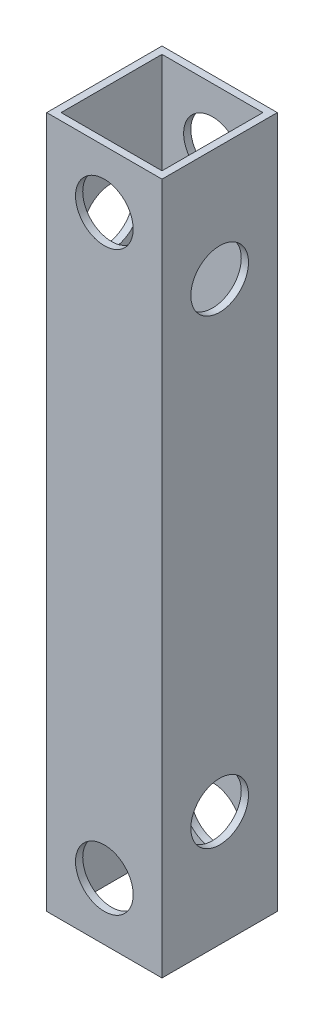
ISO-10303-21;
HEADER;
FILE_DESCRIPTION(('STEP AP214'),'2;1');
FILE_NAME('part.step','',(''),(''),'','','');
FILE_SCHEMA(('AUTOMOTIVE_DESIGN { 1 0 10303 214 1 1 1 1 }'));
ENDSEC;
DATA;
#1=APPLICATION_CONTEXT('core data for automotive mechanical design processes');
#2=APPLICATION_PROTOCOL_DEFINITION('international standard','automotive_design',2000,#1);
#3=PRODUCT_CONTEXT('',#1,'mechanical');
#4=PRODUCT('Part','Part','',(#3));
#5=PRODUCT_RELATED_PRODUCT_CATEGORY('part','',(#4));
#6=PRODUCT_DEFINITION_FORMATION('','',#4);
#7=PRODUCT_DEFINITION_CONTEXT('part definition',#1,'design');
#8=PRODUCT_DEFINITION('design','',#6,#7);
#9=PRODUCT_DEFINITION_SHAPE('','',#8);
#10=(LENGTH_UNIT() NAMED_UNIT(*) SI_UNIT(.MILLI.,.METRE.));
#11=(NAMED_UNIT(*) PLANE_ANGLE_UNIT() SI_UNIT($,.RADIAN.));
#12=(NAMED_UNIT(*) SI_UNIT($,.STERADIAN.) SOLID_ANGLE_UNIT());
#13=UNCERTAINTY_MEASURE_WITH_UNIT(LENGTH_MEASURE(1.E-05),#10,'distance_accuracy_value','');
#14=(GEOMETRIC_REPRESENTATION_CONTEXT(3) GLOBAL_UNCERTAINTY_ASSIGNED_CONTEXT((#13)) GLOBAL_UNIT_ASSIGNED_CONTEXT((#10,
#11,#12)) REPRESENTATION_CONTEXT('',''));
#15=CARTESIAN_POINT('',(0.,0.,0.));
#16=DIRECTION('',(0.,0.,1.));
#17=DIRECTION('',(1.,0.,0.));
#18=AXIS2_PLACEMENT_3D('',#15,#16,#17);
#19=CARTESIAN_POINT('',(0.,152.4,0.));
#20=DIRECTION('',(0.,1.,0.));
#21=DIRECTION('',(0.,0.,1.));
#22=AXIS2_PLACEMENT_3D('',#19,#20,#21);
#23=PLANE('',#22);
#24=DIRECTION('',(0.,0.,1.));
#25=VECTOR('',#24,1.);
#26=CARTESIAN_POINT('',(-12.7,152.4,12.7));
#27=LINE('',#26,#25);
#28=CARTESIAN_POINT('',(-12.7,152.4,-12.7));
#29=VERTEX_POINT('',#28);
#30=CARTESIAN_POINT('',(-12.7,152.4,12.7));
#31=VERTEX_POINT('',#30);
#32=EDGE_CURVE('E138',#29,#31,#27,.T.);
#33=ORIENTED_EDGE('',*,*,#32,.T.);
#34=DIRECTION('',(1.,0.,0.));
#35=VECTOR('',#34,1.);
#36=CARTESIAN_POINT('',(12.7,152.4,12.7));
#37=LINE('',#36,#35);
#38=CARTESIAN_POINT('',(12.7,152.4,12.7));
#39=VERTEX_POINT('',#38);
#40=EDGE_CURVE('E141',#31,#39,#37,.T.);
#41=ORIENTED_EDGE('',*,*,#40,.T.);
#42=DIRECTION('',(0.,0.,-1.));
#43=VECTOR('',#42,1.);
#44=CARTESIAN_POINT('',(12.7,152.4,12.7));
#45=LINE('',#44,#43);
#46=CARTESIAN_POINT('',(12.7,152.4,-12.7));
#47=VERTEX_POINT('',#46);
#48=EDGE_CURVE('E144',#39,#47,#45,.T.);
#49=ORIENTED_EDGE('',*,*,#48,.T.);
#50=DIRECTION('',(-1.,0.,0.));
#51=VECTOR('',#50,1.);
#52=CARTESIAN_POINT('',(12.7,152.4,-12.7));
#53=LINE('',#52,#51);
#54=EDGE_CURVE('E146',#47,#29,#53,.T.);
#55=ORIENTED_EDGE('',*,*,#54,.T.);
#56=EDGE_LOOP('',(#33,#41,#49,#55));
#57=FACE_BOUND('',#56,.T.);
#58=DIRECTION('',(1.,0.,0.));
#59=VECTOR('',#58,1.);
#60=CARTESIAN_POINT('',(11.1125,152.4,11.1125));
#61=LINE('',#60,#59);
#62=CARTESIAN_POINT('',(-11.1125,152.4,11.1125));
#63=VERTEX_POINT('',#62);
#64=CARTESIAN_POINT('',(11.1125,152.4,11.1125));
#65=VERTEX_POINT('',#64);
#66=EDGE_CURVE('E108',#63,#65,#61,.T.);
#67=ORIENTED_EDGE('',*,*,#66,.F.);
#68=DIRECTION('',(0.,0.,1.));
#69=VECTOR('',#68,1.);
#70=CARTESIAN_POINT('',(-11.1125,152.4,11.1125));
#71=LINE('',#70,#69);
#72=CARTESIAN_POINT('',(-11.1125,152.4,-11.1125));
#73=VERTEX_POINT('',#72);
#74=EDGE_CURVE('E100',#73,#63,#71,.T.);
#75=ORIENTED_EDGE('',*,*,#74,.F.);
#76=DIRECTION('',(-1.,0.,0.));
#77=VECTOR('',#76,1.);
#78=CARTESIAN_POINT('',(11.1125,152.4,-11.1125));
#79=LINE('',#78,#77);
#80=CARTESIAN_POINT('',(11.1125,152.4,-11.1125));
#81=VERTEX_POINT('',#80);
#82=EDGE_CURVE('E122',#81,#73,#79,.T.);
#83=ORIENTED_EDGE('',*,*,#82,.F.);
#84=DIRECTION('',(0.,0.,-1.));
#85=VECTOR('',#84,1.);
#86=CARTESIAN_POINT('',(11.1125,152.4,11.1125));
#87=LINE('',#86,#85);
#88=EDGE_CURVE('E120',#65,#81,#87,.T.);
#89=ORIENTED_EDGE('',*,*,#88,.F.);
#90=EDGE_LOOP('',(#67,#75,#83,#89));
#91=FACE_BOUND('',#90,.T.);
#92=ADVANCED_FACE('F33',(#57,#91),#23,.T.);
#93=CARTESIAN_POINT('',(0.,0.,0.));
#94=DIRECTION('',(0.,1.,0.));
#95=DIRECTION('',(0.,0.,1.));
#96=AXIS2_PLACEMENT_3D('',#93,#94,#95);
#97=PLANE('',#96);
#98=DIRECTION('',(0.,0.,1.));
#99=VECTOR('',#98,1.);
#100=CARTESIAN_POINT('',(-12.7,0.,12.7));
#101=LINE('',#100,#99);
#102=CARTESIAN_POINT('',(-12.7,0.,-12.7));
#103=VERTEX_POINT('',#102);
#104=CARTESIAN_POINT('',(-12.7,0.,12.7));
#105=VERTEX_POINT('',#104);
#106=EDGE_CURVE('E116',#103,#105,#101,.T.);
#107=ORIENTED_EDGE('',*,*,#106,.F.);
#108=DIRECTION('',(-1.,0.,0.));
#109=VECTOR('',#108,1.);
#110=CARTESIAN_POINT('',(12.7,0.,-12.7));
#111=LINE('',#110,#109);
#112=CARTESIAN_POINT('',(12.7,0.,-12.7));
#113=VERTEX_POINT('',#112);
#114=EDGE_CURVE('E142',#113,#103,#111,.T.);
#115=ORIENTED_EDGE('',*,*,#114,.F.);
#116=DIRECTION('',(0.,0.,-1.));
#117=VECTOR('',#116,1.);
#118=CARTESIAN_POINT('',(12.7,0.,12.7));
#119=LINE('',#118,#117);
#120=CARTESIAN_POINT('',(12.7,0.,12.7));
#121=VERTEX_POINT('',#120);
#122=EDGE_CURVE('E153',#121,#113,#119,.T.);
#123=ORIENTED_EDGE('',*,*,#122,.F.);
#124=DIRECTION('',(1.,0.,0.));
#125=VECTOR('',#124,1.);
#126=CARTESIAN_POINT('',(12.7,0.,12.7));
#127=LINE('',#126,#125);
#128=EDGE_CURVE('E151',#105,#121,#127,.T.);
#129=ORIENTED_EDGE('',*,*,#128,.F.);
#130=EDGE_LOOP('',(#107,#115,#123,#129));
#131=FACE_BOUND('',#130,.T.);
#132=DIRECTION('',(0.,0.,1.));
#133=VECTOR('',#132,1.);
#134=CARTESIAN_POINT('',(-11.1125,0.,11.1125));
#135=LINE('',#134,#133);
#136=CARTESIAN_POINT('',(-11.1125,0.,-11.1125));
#137=VERTEX_POINT('',#136);
#138=CARTESIAN_POINT('',(-11.1125,0.,11.1125));
#139=VERTEX_POINT('',#138);
#140=EDGE_CURVE('E58',#137,#139,#135,.T.);
#141=ORIENTED_EDGE('',*,*,#140,.T.);
#142=DIRECTION('',(1.,0.,0.));
#143=VECTOR('',#142,1.);
#144=CARTESIAN_POINT('',(11.1125,0.,11.1125));
#145=LINE('',#144,#143);
#146=CARTESIAN_POINT('',(11.1125,0.,11.1125));
#147=VERTEX_POINT('',#146);
#148=EDGE_CURVE('E115',#139,#147,#145,.T.);
#149=ORIENTED_EDGE('',*,*,#148,.T.);
#150=DIRECTION('',(0.,0.,-1.));
#151=VECTOR('',#150,1.);
#152=CARTESIAN_POINT('',(11.1125,0.,11.1125));
#153=LINE('',#152,#151);
#154=CARTESIAN_POINT('',(11.1125,0.,-11.1125));
#155=VERTEX_POINT('',#154);
#156=EDGE_CURVE('E130',#147,#155,#153,.T.);
#157=ORIENTED_EDGE('',*,*,#156,.T.);
#158=DIRECTION('',(-1.,0.,0.));
#159=VECTOR('',#158,1.);
#160=CARTESIAN_POINT('',(11.1125,0.,-11.1125));
#161=LINE('',#160,#159);
#162=EDGE_CURVE('E109',#155,#137,#161,.T.);
#163=ORIENTED_EDGE('',*,*,#162,.T.);
#164=EDGE_LOOP('',(#141,#149,#157,#163));
#165=FACE_BOUND('',#164,.T.);
#166=ADVANCED_FACE('F226',(#131,#165),#97,.F.);
#167=CARTESIAN_POINT('',(-12.7,152.4,12.7));
#168=DIRECTION('',(1.,0.,0.));
#169=DIRECTION('',(0.,0.,-1.));
#170=AXIS2_PLACEMENT_3D('',#167,#168,#169);
#171=PLANE('',#170);
#172=CARTESIAN_POINT('',(-12.7,25.4,0.));
#173=DIRECTION('',(1.,0.,0.));
#174=DIRECTION('',(0.,0.,-1.));
#175=AXIS2_PLACEMENT_3D('',#172,#173,#174);
#176=CIRCLE('',#175,6.35);
#177=CARTESIAN_POINT('',(-12.7,25.4,-6.35));
#178=VERTEX_POINT('',#177);
#179=EDGE_CURVE('E182',#178,#178,#176,.T.);
#180=ORIENTED_EDGE('',*,*,#179,.T.);
#181=EDGE_LOOP('',(#180));
#182=FACE_BOUND('',#181,.T.);
#183=CARTESIAN_POINT('',(-12.7,127.,0.));
#184=DIRECTION('',(1.,0.,0.));
#185=DIRECTION('',(0.,0.,-1.));
#186=AXIS2_PLACEMENT_3D('',#183,#184,#185);
#187=CIRCLE('',#186,6.35);
#188=CARTESIAN_POINT('',(-12.7,127.,-6.35));
#189=VERTEX_POINT('',#188);
#190=EDGE_CURVE('E197',#189,#189,#187,.T.);
#191=ORIENTED_EDGE('',*,*,#190,.T.);
#192=EDGE_LOOP('',(#191));
#193=FACE_BOUND('',#192,.T.);
#194=ORIENTED_EDGE('',*,*,#106,.T.);
#195=DIRECTION('',(0.,-1.,0.));
#196=VECTOR('',#195,1.);
#197=CARTESIAN_POINT('',(-12.7,152.4,12.7));
#198=LINE('',#197,#196);
#199=EDGE_CURVE('E11',#31,#105,#198,.T.);
#200=ORIENTED_EDGE('',*,*,#199,.F.);
#201=ORIENTED_EDGE('',*,*,#32,.F.);
#202=DIRECTION('',(0.,-1.,0.));
#203=VECTOR('',#202,1.);
#204=CARTESIAN_POINT('',(-12.7,152.4,-12.7));
#205=LINE('',#204,#203);
#206=EDGE_CURVE('E148',#29,#103,#205,.T.);
#207=ORIENTED_EDGE('',*,*,#206,.T.);
#208=EDGE_LOOP('',(#194,#200,#201,#207));
#209=FACE_BOUND('',#208,.T.);
#210=ADVANCED_FACE('F35',(#182,#193,#209),#171,.F.);
#211=CARTESIAN_POINT('',(12.7,152.4,12.7));
#212=DIRECTION('',(0.,0.,-1.));
#213=DIRECTION('',(-1.,0.,0.));
#214=AXIS2_PLACEMENT_3D('',#211,#212,#213);
#215=PLANE('',#214);
#216=CARTESIAN_POINT('',(0.,12.7,12.7));
#217=DIRECTION('',(0.,0.,-1.));
#218=DIRECTION('',(-1.,0.,0.));
#219=AXIS2_PLACEMENT_3D('',#216,#217,#218);
#220=CIRCLE('',#219,6.35);
#221=CARTESIAN_POINT('',(-6.35,12.7,12.7));
#222=VERTEX_POINT('',#221);
#223=EDGE_CURVE('E179',#222,#222,#220,.T.);
#224=ORIENTED_EDGE('',*,*,#223,.T.);
#225=EDGE_LOOP('',(#224));
#226=FACE_BOUND('',#225,.T.);
#227=CARTESIAN_POINT('',(0.,139.7,12.7));
#228=DIRECTION('',(0.,0.,-1.));
#229=DIRECTION('',(-1.,0.,0.));
#230=AXIS2_PLACEMENT_3D('',#227,#228,#229);
#231=CIRCLE('',#230,6.34999999999999);
#232=CARTESIAN_POINT('',(-6.34999999999999,139.7,12.7));
#233=VERTEX_POINT('',#232);
#234=EDGE_CURVE('E128',#233,#233,#231,.T.);
#235=ORIENTED_EDGE('',*,*,#234,.T.);
#236=EDGE_LOOP('',(#235));
#237=FACE_BOUND('',#236,.T.);
#238=ORIENTED_EDGE('',*,*,#128,.T.);
#239=DIRECTION('',(0.,-1.,0.));
#240=VECTOR('',#239,1.);
#241=CARTESIAN_POINT('',(12.7,152.4,12.7));
#242=LINE('',#241,#240);
#243=EDGE_CURVE('E42',#39,#121,#242,.T.);
#244=ORIENTED_EDGE('',*,*,#243,.F.);
#245=ORIENTED_EDGE('',*,*,#40,.F.);
#246=ORIENTED_EDGE('',*,*,#199,.T.);
#247=EDGE_LOOP('',(#238,#244,#245,#246));
#248=FACE_BOUND('',#247,.T.);
#249=ADVANCED_FACE('F206',(#226,#237,#248),#215,.F.);
#250=CARTESIAN_POINT('',(12.7,152.4,12.7));
#251=DIRECTION('',(-1.,0.,0.));
#252=DIRECTION('',(0.,0.,1.));
#253=AXIS2_PLACEMENT_3D('',#250,#251,#252);
#254=PLANE('',#253);
#255=CARTESIAN_POINT('',(12.7,25.4,0.));
#256=DIRECTION('',(1.,0.,0.));
#257=DIRECTION('',(0.,0.,-1.));
#258=AXIS2_PLACEMENT_3D('',#255,#256,#257);
#259=CIRCLE('',#258,6.35);
#260=CARTESIAN_POINT('',(12.7,25.4,-6.35));
#261=VERTEX_POINT('',#260);
#262=EDGE_CURVE('E413',#261,#261,#259,.T.);
#263=ORIENTED_EDGE('',*,*,#262,.F.);
#264=EDGE_LOOP('',(#263));
#265=FACE_BOUND('',#264,.T.);
#266=CARTESIAN_POINT('',(12.7,127.,0.));
#267=DIRECTION('',(1.,0.,0.));
#268=DIRECTION('',(0.,0.,-1.));
#269=AXIS2_PLACEMENT_3D('',#266,#267,#268);
#270=CIRCLE('',#269,6.35);
#271=CARTESIAN_POINT('',(12.7,127.,-6.35));
#272=VERTEX_POINT('',#271);
#273=EDGE_CURVE('E171',#272,#272,#270,.T.);
#274=ORIENTED_EDGE('',*,*,#273,.F.);
#275=EDGE_LOOP('',(#274));
#276=FACE_BOUND('',#275,.T.);
#277=ORIENTED_EDGE('',*,*,#122,.T.);
#278=DIRECTION('',(0.,-1.,0.));
#279=VECTOR('',#278,1.);
#280=CARTESIAN_POINT('',(12.7,152.4,-12.7));
#281=LINE('',#280,#279);
#282=EDGE_CURVE('E158',#47,#113,#281,.T.);
#283=ORIENTED_EDGE('',*,*,#282,.F.);
#284=ORIENTED_EDGE('',*,*,#48,.F.);
#285=ORIENTED_EDGE('',*,*,#243,.T.);
#286=EDGE_LOOP('',(#277,#283,#284,#285));
#287=FACE_BOUND('',#286,.T.);
#288=ADVANCED_FACE('F240',(#265,#276,#287),#254,.F.);
#289=CARTESIAN_POINT('',(12.7,152.4,-12.7));
#290=DIRECTION('',(0.,0.,1.));
#291=DIRECTION('',(1.,0.,0.));
#292=AXIS2_PLACEMENT_3D('',#289,#290,#291);
#293=PLANE('',#292);
#294=CARTESIAN_POINT('',(0.,12.7,-12.7));
#295=DIRECTION('',(0.,0.,-1.));
#296=DIRECTION('',(-1.,0.,0.));
#297=AXIS2_PLACEMENT_3D('',#294,#295,#296);
#298=CIRCLE('',#297,6.35);
#299=CARTESIAN_POINT('',(-6.35,12.7,-12.7));
#300=VERTEX_POINT('',#299);
#301=EDGE_CURVE('E175',#300,#300,#298,.T.);
#302=ORIENTED_EDGE('',*,*,#301,.F.);
#303=EDGE_LOOP('',(#302));
#304=FACE_BOUND('',#303,.T.);
#305=CARTESIAN_POINT('',(0.,139.7,-12.7));
#306=DIRECTION('',(0.,0.,-1.));
#307=DIRECTION('',(-1.,0.,0.));
#308=AXIS2_PLACEMENT_3D('',#305,#306,#307);
#309=CIRCLE('',#308,6.34999999999999);
#310=CARTESIAN_POINT('',(-6.34999999999999,139.7,-12.7));
#311=VERTEX_POINT('',#310);
#312=EDGE_CURVE('E167',#311,#311,#309,.T.);
#313=ORIENTED_EDGE('',*,*,#312,.F.);
#314=EDGE_LOOP('',(#313));
#315=FACE_BOUND('',#314,.T.);
#316=ORIENTED_EDGE('',*,*,#114,.T.);
#317=ORIENTED_EDGE('',*,*,#206,.F.);
#318=ORIENTED_EDGE('',*,*,#54,.F.);
#319=ORIENTED_EDGE('',*,*,#282,.T.);
#320=EDGE_LOOP('',(#316,#317,#318,#319));
#321=FACE_BOUND('',#320,.T.);
#322=ADVANCED_FACE('F237',(#304,#315,#321),#293,.F.);
#323=CARTESIAN_POINT('',(-11.1125,152.4,11.1125));
#324=DIRECTION('',(1.,0.,0.));
#325=DIRECTION('',(0.,0.,-1.));
#326=AXIS2_PLACEMENT_3D('',#323,#324,#325);
#327=PLANE('',#326);
#328=CARTESIAN_POINT('',(-11.1125,25.4,0.));
#329=DIRECTION('',(1.,0.,0.));
#330=DIRECTION('',(0.,0.,-1.));
#331=AXIS2_PLACEMENT_3D('',#328,#329,#330);
#332=CIRCLE('',#331,6.35);
#333=CARTESIAN_POINT('',(-11.1125,25.4,-6.35));
#334=VERTEX_POINT('',#333);
#335=EDGE_CURVE('E187',#334,#334,#332,.T.);
#336=ORIENTED_EDGE('',*,*,#335,.F.);
#337=EDGE_LOOP('',(#336));
#338=FACE_BOUND('',#337,.T.);
#339=CARTESIAN_POINT('',(-11.1125,127.,0.));
#340=DIRECTION('',(1.,0.,0.));
#341=DIRECTION('',(0.,0.,-1.));
#342=AXIS2_PLACEMENT_3D('',#339,#340,#341);
#343=CIRCLE('',#342,6.35);
#344=CARTESIAN_POINT('',(-11.1125,127.,-6.35));
#345=VERTEX_POINT('',#344);
#346=EDGE_CURVE('E170',#345,#345,#343,.T.);
#347=ORIENTED_EDGE('',*,*,#346,.F.);
#348=EDGE_LOOP('',(#347));
#349=FACE_BOUND('',#348,.T.);
#350=ORIENTED_EDGE('',*,*,#140,.F.);
#351=DIRECTION('',(0.,-1.,0.));
#352=VECTOR('',#351,1.);
#353=CARTESIAN_POINT('',(-11.1125,152.4,-11.1125));
#354=LINE('',#353,#352);
#355=EDGE_CURVE('E104',#73,#137,#354,.T.);
#356=ORIENTED_EDGE('',*,*,#355,.F.);
#357=ORIENTED_EDGE('',*,*,#74,.T.);
#358=DIRECTION('',(0.,-1.,0.));
#359=VECTOR('',#358,1.);
#360=CARTESIAN_POINT('',(-11.1125,152.4,11.1125));
#361=LINE('',#360,#359);
#362=EDGE_CURVE('E103',#63,#139,#361,.T.);
#363=ORIENTED_EDGE('',*,*,#362,.T.);
#364=EDGE_LOOP('',(#350,#356,#357,#363));
#365=FACE_BOUND('',#364,.T.);
#366=ADVANCED_FACE('F102',(#338,#349,#365),#327,.T.);
#367=CARTESIAN_POINT('',(11.1125,152.4,11.1125));
#368=DIRECTION('',(0.,0.,-1.));
#369=DIRECTION('',(-1.,0.,0.));
#370=AXIS2_PLACEMENT_3D('',#367,#368,#369);
#371=PLANE('',#370);
#372=CARTESIAN_POINT('',(0.,12.7,11.1125));
#373=DIRECTION('',(0.,0.,-1.));
#374=DIRECTION('',(-1.,0.,0.));
#375=AXIS2_PLACEMENT_3D('',#372,#373,#374);
#376=CIRCLE('',#375,6.35);
#377=CARTESIAN_POINT('',(-6.35,12.7,11.1125));
#378=VERTEX_POINT('',#377);
#379=EDGE_CURVE('E174',#378,#378,#376,.T.);
#380=ORIENTED_EDGE('',*,*,#379,.F.);
#381=EDGE_LOOP('',(#380));
#382=FACE_BOUND('',#381,.T.);
#383=CARTESIAN_POINT('',(0.,139.7,11.1125));
#384=DIRECTION('',(0.,0.,-1.));
#385=DIRECTION('',(-1.,0.,0.));
#386=AXIS2_PLACEMENT_3D('',#383,#384,#385);
#387=CIRCLE('',#386,6.34999999999999);
#388=CARTESIAN_POINT('',(-6.34999999999999,139.7,11.1125));
#389=VERTEX_POINT('',#388);
#390=EDGE_CURVE('E166',#389,#389,#387,.T.);
#391=ORIENTED_EDGE('',*,*,#390,.F.);
#392=EDGE_LOOP('',(#391));
#393=FACE_BOUND('',#392,.T.);
#394=ORIENTED_EDGE('',*,*,#148,.F.);
#395=ORIENTED_EDGE('',*,*,#362,.F.);
#396=ORIENTED_EDGE('',*,*,#66,.T.);
#397=DIRECTION('',(0.,-1.,0.));
#398=VECTOR('',#397,1.);
#399=CARTESIAN_POINT('',(11.1125,152.4,11.1125));
#400=LINE('',#399,#398);
#401=EDGE_CURVE('E117',#65,#147,#400,.T.);
#402=ORIENTED_EDGE('',*,*,#401,.T.);
#403=EDGE_LOOP('',(#394,#395,#396,#402));
#404=FACE_BOUND('',#403,.T.);
#405=ADVANCED_FACE('F112',(#382,#393,#404),#371,.T.);
#406=CARTESIAN_POINT('',(11.1125,152.4,11.1125));
#407=DIRECTION('',(-1.,0.,0.));
#408=DIRECTION('',(0.,0.,1.));
#409=AXIS2_PLACEMENT_3D('',#406,#407,#408);
#410=PLANE('',#409);
#411=CARTESIAN_POINT('',(11.1125,25.4,0.));
#412=DIRECTION('',(-1.,0.,0.));
#413=DIRECTION('',(0.,0.,1.));
#414=AXIS2_PLACEMENT_3D('',#411,#412,#413);
#415=CIRCLE('',#414,6.35);
#416=CARTESIAN_POINT('',(11.1125,25.4,6.35));
#417=VERTEX_POINT('',#416);
#418=EDGE_CURVE('E37',#417,#417,#415,.T.);
#419=ORIENTED_EDGE('',*,*,#418,.F.);
#420=EDGE_LOOP('',(#419));
#421=FACE_BOUND('',#420,.T.);
#422=CARTESIAN_POINT('',(11.1125,127.,0.));
#423=DIRECTION('',(-1.,0.,0.));
#424=DIRECTION('',(0.,0.,1.));
#425=AXIS2_PLACEMENT_3D('',#422,#423,#424);
#426=CIRCLE('',#425,6.35);
#427=CARTESIAN_POINT('',(11.1125,127.,6.35));
#428=VERTEX_POINT('',#427);
#429=EDGE_CURVE('E168',#428,#428,#426,.T.);
#430=ORIENTED_EDGE('',*,*,#429,.F.);
#431=EDGE_LOOP('',(#430));
#432=FACE_BOUND('',#431,.T.);
#433=ORIENTED_EDGE('',*,*,#156,.F.);
#434=ORIENTED_EDGE('',*,*,#401,.F.);
#435=ORIENTED_EDGE('',*,*,#88,.T.);
#436=DIRECTION('',(0.,-1.,0.));
#437=VECTOR('',#436,1.);
#438=CARTESIAN_POINT('',(11.1125,152.4,-11.1125));
#439=LINE('',#438,#437);
#440=EDGE_CURVE('E50',#81,#155,#439,.T.);
#441=ORIENTED_EDGE('',*,*,#440,.T.);
#442=EDGE_LOOP('',(#433,#434,#435,#441));
#443=FACE_BOUND('',#442,.T.);
#444=ADVANCED_FACE('F270',(#421,#432,#443),#410,.T.);
#445=CARTESIAN_POINT('',(11.1125,152.4,-11.1125));
#446=DIRECTION('',(0.,0.,1.));
#447=DIRECTION('',(1.,0.,0.));
#448=AXIS2_PLACEMENT_3D('',#445,#446,#447);
#449=PLANE('',#448);
#450=CARTESIAN_POINT('',(0.,12.7,-11.1125));
#451=DIRECTION('',(0.,0.,1.));
#452=DIRECTION('',(1.,0.,0.));
#453=AXIS2_PLACEMENT_3D('',#450,#451,#452);
#454=CIRCLE('',#453,6.35);
#455=CARTESIAN_POINT('',(6.35,12.7,-11.1125));
#456=VERTEX_POINT('',#455);
#457=EDGE_CURVE('E172',#456,#456,#454,.T.);
#458=ORIENTED_EDGE('',*,*,#457,.F.);
#459=EDGE_LOOP('',(#458));
#460=FACE_BOUND('',#459,.T.);
#461=CARTESIAN_POINT('',(0.,139.7,-11.1125));
#462=DIRECTION('',(0.,0.,1.));
#463=DIRECTION('',(1.,0.,0.));
#464=AXIS2_PLACEMENT_3D('',#461,#462,#463);
#465=CIRCLE('',#464,6.34999999999999);
#466=CARTESIAN_POINT('',(6.35,139.7,-11.1125));
#467=VERTEX_POINT('',#466);
#468=EDGE_CURVE('E163',#467,#467,#465,.T.);
#469=ORIENTED_EDGE('',*,*,#468,.F.);
#470=EDGE_LOOP('',(#469));
#471=FACE_BOUND('',#470,.T.);
#472=ORIENTED_EDGE('',*,*,#162,.F.);
#473=ORIENTED_EDGE('',*,*,#440,.F.);
#474=ORIENTED_EDGE('',*,*,#82,.T.);
#475=ORIENTED_EDGE('',*,*,#355,.T.);
#476=EDGE_LOOP('',(#472,#473,#474,#475));
#477=FACE_BOUND('',#476,.T.);
#478=ADVANCED_FACE('F222',(#460,#471,#477),#449,.T.);
#479=CARTESIAN_POINT('',(0.,139.7,114.3));
#480=DIRECTION('',(0.,0.,-1.));
#481=DIRECTION('',(-1.,0.,0.));
#482=AXIS2_PLACEMENT_3D('',#479,#480,#481);
#483=CYLINDRICAL_SURFACE('',#482,6.34999999999999);
#484=ORIENTED_EDGE('',*,*,#468,.T.);
#485=EDGE_LOOP('',(#484));
#486=FACE_BOUND('',#485,.T.);
#487=ORIENTED_EDGE('',*,*,#312,.T.);
#488=EDGE_LOOP('',(#487));
#489=FACE_BOUND('',#488,.T.);
#490=ADVANCED_FACE('F212',(#486,#489),#483,.F.);
#491=CARTESIAN_POINT('',(-6.34999999999999,139.7,11.1125));
#492=CARTESIAN_POINT('',(-6.34999999999999,139.7,11.1290364583333));
#493=CARTESIAN_POINT('',(-6.34999999999999,139.7,11.1455729166667));
#494=CARTESIAN_POINT('',(-6.34999999999999,139.7,11.1786458333333));
#495=CARTESIAN_POINT('',(-6.34999999999999,139.7,11.1951822916667));
#496=CARTESIAN_POINT('',(-6.34999999999999,139.7,11.2282552083333));
#497=CARTESIAN_POINT('',(-6.34999999999999,139.7,11.2447916666667));
#498=CARTESIAN_POINT('',(-6.34999999999999,139.7,11.2778645833333));
#499=CARTESIAN_POINT('',(-6.34999999999999,139.7,11.2944010416667));
#500=CARTESIAN_POINT('',(-6.34999999999999,139.7,11.3274739583333));
#501=CARTESIAN_POINT('',(-6.34999999999999,139.7,11.3440104166667));
#502=CARTESIAN_POINT('',(-6.34999999999999,139.7,11.3770833333333));
#503=CARTESIAN_POINT('',(-6.34999999999999,139.7,11.3936197916667));
#504=CARTESIAN_POINT('',(-6.34999999999999,139.7,11.4266927083333));
#505=CARTESIAN_POINT('',(-6.34999999999999,139.7,11.4432291666667));
#506=CARTESIAN_POINT('',(-6.34999999999999,139.7,11.4763020833333));
#507=CARTESIAN_POINT('',(-6.34999999999999,139.7,11.4928385416667));
#508=CARTESIAN_POINT('',(-6.34999999999999,139.7,11.5259114583333));
#509=CARTESIAN_POINT('',(-6.34999999999999,139.7,11.5424479166667));
#510=CARTESIAN_POINT('',(-6.34999999999999,139.7,11.5755208333333));
#511=CARTESIAN_POINT('',(-6.34999999999999,139.7,11.5920572916667));
#512=CARTESIAN_POINT('',(-6.34999999999999,139.7,11.6251302083333));
#513=CARTESIAN_POINT('',(-6.34999999999999,139.7,11.6416666666667));
#514=CARTESIAN_POINT('',(-6.34999999999999,139.7,11.6747395833333));
#515=CARTESIAN_POINT('',(-6.34999999999999,139.7,11.6912760416667));
#516=CARTESIAN_POINT('',(-6.34999999999999,139.7,11.7243489583333));
#517=CARTESIAN_POINT('',(-6.34999999999999,139.7,11.7408854166667));
#518=CARTESIAN_POINT('',(-6.34999999999999,139.7,11.7739583333333));
#519=CARTESIAN_POINT('',(-6.34999999999999,139.7,11.7904947916667));
#520=CARTESIAN_POINT('',(-6.34999999999999,139.7,11.8235677083333));
#521=CARTESIAN_POINT('',(-6.34999999999999,139.7,11.8401041666667));
#522=CARTESIAN_POINT('',(-6.34999999999999,139.7,11.8731770833333));
#523=CARTESIAN_POINT('',(-6.34999999999999,139.7,11.8897135416667));
#524=CARTESIAN_POINT('',(-6.34999999999999,139.7,11.9227864583333));
#525=CARTESIAN_POINT('',(-6.34999999999999,139.7,11.9393229166667));
#526=CARTESIAN_POINT('',(-6.34999999999999,139.7,11.9723958333333));
#527=CARTESIAN_POINT('',(-6.34999999999999,139.7,11.9889322916667));
#528=CARTESIAN_POINT('',(-6.34999999999999,139.7,12.0220052083333));
#529=CARTESIAN_POINT('',(-6.34999999999999,139.7,12.0385416666667));
#530=CARTESIAN_POINT('',(-6.34999999999999,139.7,12.0716145833333));
#531=CARTESIAN_POINT('',(-6.34999999999999,139.7,12.0881510416667));
#532=CARTESIAN_POINT('',(-6.34999999999999,139.7,12.1212239583333));
#533=CARTESIAN_POINT('',(-6.34999999999999,139.7,12.1377604166667));
#534=CARTESIAN_POINT('',(-6.34999999999999,139.7,12.1708333333333));
#535=CARTESIAN_POINT('',(-6.34999999999999,139.7,12.1873697916667));
#536=CARTESIAN_POINT('',(-6.34999999999999,139.7,12.2204427083333));
#537=CARTESIAN_POINT('',(-6.34999999999999,139.7,12.2369791666667));
#538=CARTESIAN_POINT('',(-6.34999999999999,139.7,12.2700520833333));
#539=CARTESIAN_POINT('',(-6.34999999999999,139.7,12.2865885416667));
#540=CARTESIAN_POINT('',(-6.34999999999999,139.7,12.3196614583333));
#541=CARTESIAN_POINT('',(-6.34999999999999,139.7,12.3361979166667));
#542=CARTESIAN_POINT('',(-6.34999999999999,139.7,12.3692708333333));
#543=CARTESIAN_POINT('',(-6.34999999999999,139.7,12.3858072916667));
#544=CARTESIAN_POINT('',(-6.34999999999999,139.7,12.4188802083333));
#545=CARTESIAN_POINT('',(-6.34999999999999,139.7,12.4354166666667));
#546=CARTESIAN_POINT('',(-6.34999999999999,139.7,12.4684895833333));
#547=CARTESIAN_POINT('',(-6.34999999999999,139.7,12.4850260416667));
#548=CARTESIAN_POINT('',(-6.34999999999999,139.7,12.5180989583333));
#549=CARTESIAN_POINT('',(-6.34999999999999,139.7,12.5346354166667));
#550=CARTESIAN_POINT('',(-6.34999999999999,139.7,12.5677083333333));
#551=CARTESIAN_POINT('',(-6.34999999999999,139.7,12.5842447916667));
#552=CARTESIAN_POINT('',(-6.34999999999999,139.7,12.6173177083333));
#553=CARTESIAN_POINT('',(-6.34999999999999,139.7,12.6338541666667));
#554=CARTESIAN_POINT('',(-6.34999999999999,139.7,12.6669270833333));
#555=CARTESIAN_POINT('',(-6.34999999999999,139.7,12.6834635416667));
#556=CARTESIAN_POINT('',(-6.34999999999999,139.7,12.7));
#557=B_SPLINE_CURVE_WITH_KNOTS('',3,(#491,#492,#493,#494,#495,#496,#497,#498,#499,#500,#501,
#502,#503,#504,#505,#506,#507,#508,#509,#510,#511,#512,#513,#514,#515,#516,#517,#518,#519,#520,
#521,#522,#523,#524,#525,#526,#527,#528,#529,#530,#531,#532,#533,#534,#535,#536,#537,#538,#539,
#540,#541,#542,#543,#544,#545,#546,#547,#548,#549,#550,#551,#552,#553,#554,#555,#556),
.UNSPECIFIED.,.F.,.F.,(4,2,2,2,2,2,2,2,2,2,2,2,2,2,2,2,2,2,2,2,2,2,2,2,2,2,2,2,2,2,2,2,4),(0.,
0.0496093749999954,0.0992187500000047,0.148828125,0.198437499999995,0.248046875000005,
0.29765625,0.347265624999996,0.396874999999991,0.446484375,0.496093749999996,0.545703124999991,
0.5953125,0.644921874999996,0.694531249999991,0.744140625,0.793749999999996,0.843359374999991,
0.892968750000001,0.942578124999996,0.992187499999991,1.041796875,1.09140625,1.14101562499999,
1.190625,1.240234375,1.28984374999999,1.33945312499999,1.3890625,1.43867187499999,
1.48828124999999,1.537890625,1.58749999999999),.UNSPECIFIED.);
#558=EDGE_CURVE('BSEAM209',#389,#233,#557,.T.);
#559=ORIENTED_EDGE('',*,*,#390,.T.);
#560=ORIENTED_EDGE('',*,*,#234,.F.);
#561=ORIENTED_EDGE('',*,*,#558,.T.);
#562=ORIENTED_EDGE('',*,*,#558,.F.);
#563=EDGE_LOOP('',(#559,#561,#560,#562));
#564=FACE_BOUND('',#563,.T.);
#565=ADVANCED_FACE('F209',(#564),#483,.F.);
#566=CARTESIAN_POINT('',(-114.3,127.,0.));
#567=DIRECTION('',(1.,0.,0.));
#568=DIRECTION('',(0.,0.,-1.));
#569=AXIS2_PLACEMENT_3D('',#566,#567,#568);
#570=CYLINDRICAL_SURFACE('',#569,6.35);
#571=ORIENTED_EDGE('',*,*,#429,.T.);
#572=EDGE_LOOP('',(#571));
#573=FACE_BOUND('',#572,.T.);
#574=ORIENTED_EDGE('',*,*,#273,.T.);
#575=EDGE_LOOP('',(#574));
#576=FACE_BOUND('',#575,.T.);
#577=ADVANCED_FACE('F211',(#573,#576),#570,.F.);
#578=CARTESIAN_POINT('',(-11.1125,127.,-6.35));
#579=CARTESIAN_POINT('',(-11.1290364583333,127.,-6.35));
#580=CARTESIAN_POINT('',(-11.1455729166667,127.,-6.35));
#581=CARTESIAN_POINT('',(-11.1786458333333,127.,-6.35));
#582=CARTESIAN_POINT('',(-11.1951822916667,127.,-6.35));
#583=CARTESIAN_POINT('',(-11.2282552083333,127.,-6.35));
#584=CARTESIAN_POINT('',(-11.2447916666667,127.,-6.35));
#585=CARTESIAN_POINT('',(-11.2778645833333,127.,-6.35));
#586=CARTESIAN_POINT('',(-11.2944010416667,127.,-6.35));
#587=CARTESIAN_POINT('',(-11.3274739583333,127.,-6.35));
#588=CARTESIAN_POINT('',(-11.3440104166667,127.,-6.35));
#589=CARTESIAN_POINT('',(-11.3770833333333,127.,-6.35));
#590=CARTESIAN_POINT('',(-11.3936197916667,127.,-6.35));
#591=CARTESIAN_POINT('',(-11.4266927083333,127.,-6.35));
#592=CARTESIAN_POINT('',(-11.4432291666667,127.,-6.35));
#593=CARTESIAN_POINT('',(-11.4763020833333,127.,-6.35));
#594=CARTESIAN_POINT('',(-11.4928385416667,127.,-6.35));
#595=CARTESIAN_POINT('',(-11.5259114583333,127.,-6.35));
#596=CARTESIAN_POINT('',(-11.5424479166667,127.,-6.35));
#597=CARTESIAN_POINT('',(-11.5755208333333,127.,-6.35));
#598=CARTESIAN_POINT('',(-11.5920572916667,127.,-6.35));
#599=CARTESIAN_POINT('',(-11.6251302083333,127.,-6.35));
#600=CARTESIAN_POINT('',(-11.6416666666667,127.,-6.35));
#601=CARTESIAN_POINT('',(-11.6747395833333,127.,-6.35));
#602=CARTESIAN_POINT('',(-11.6912760416667,127.,-6.35));
#603=CARTESIAN_POINT('',(-11.7243489583333,127.,-6.35));
#604=CARTESIAN_POINT('',(-11.7408854166667,127.,-6.35));
#605=CARTESIAN_POINT('',(-11.7739583333333,127.,-6.35));
#606=CARTESIAN_POINT('',(-11.7904947916667,127.,-6.35));
#607=CARTESIAN_POINT('',(-11.8235677083333,127.,-6.35));
#608=CARTESIAN_POINT('',(-11.8401041666667,127.,-6.35));
#609=CARTESIAN_POINT('',(-11.8731770833333,127.,-6.35));
#610=CARTESIAN_POINT('',(-11.8897135416667,127.,-6.35));
#611=CARTESIAN_POINT('',(-11.9227864583333,127.,-6.35));
#612=CARTESIAN_POINT('',(-11.9393229166667,127.,-6.35));
#613=CARTESIAN_POINT('',(-11.9723958333333,127.,-6.35));
#614=CARTESIAN_POINT('',(-11.9889322916667,127.,-6.35));
#615=CARTESIAN_POINT('',(-12.0220052083333,127.,-6.35));
#616=CARTESIAN_POINT('',(-12.0385416666667,127.,-6.35));
#617=CARTESIAN_POINT('',(-12.0716145833333,127.,-6.35));
#618=CARTESIAN_POINT('',(-12.0881510416667,127.,-6.35));
#619=CARTESIAN_POINT('',(-12.1212239583333,127.,-6.35));
#620=CARTESIAN_POINT('',(-12.1377604166667,127.,-6.35));
#621=CARTESIAN_POINT('',(-12.1708333333333,127.,-6.35));
#622=CARTESIAN_POINT('',(-12.1873697916667,127.,-6.35));
#623=CARTESIAN_POINT('',(-12.2204427083333,127.,-6.35));
#624=CARTESIAN_POINT('',(-12.2369791666667,127.,-6.35));
#625=CARTESIAN_POINT('',(-12.2700520833333,127.,-6.35));
#626=CARTESIAN_POINT('',(-12.2865885416667,127.,-6.35));
#627=CARTESIAN_POINT('',(-12.3196614583333,127.,-6.35));
#628=CARTESIAN_POINT('',(-12.3361979166667,127.,-6.35));
#629=CARTESIAN_POINT('',(-12.3692708333333,127.,-6.35));
#630=CARTESIAN_POINT('',(-12.3858072916667,127.,-6.35));
#631=CARTESIAN_POINT('',(-12.4188802083333,127.,-6.35));
#632=CARTESIAN_POINT('',(-12.4354166666667,127.,-6.35));
#633=CARTESIAN_POINT('',(-12.4684895833333,127.,-6.35));
#634=CARTESIAN_POINT('',(-12.4850260416667,127.,-6.35));
#635=CARTESIAN_POINT('',(-12.5180989583333,127.,-6.35));
#636=CARTESIAN_POINT('',(-12.5346354166667,127.,-6.35));
#637=CARTESIAN_POINT('',(-12.5677083333333,127.,-6.35));
#638=CARTESIAN_POINT('',(-12.5842447916667,127.,-6.35));
#639=CARTESIAN_POINT('',(-12.6173177083333,127.,-6.35));
#640=CARTESIAN_POINT('',(-12.6338541666667,127.,-6.35));
#641=CARTESIAN_POINT('',(-12.6669270833333,127.,-6.35));
#642=CARTESIAN_POINT('',(-12.6834635416667,127.,-6.35));
#643=CARTESIAN_POINT('',(-12.7,127.,-6.35));
#644=B_SPLINE_CURVE_WITH_KNOTS('',3,(#578,#579,#580,#581,#582,#583,#584,#585,#586,#587,#588,
#589,#590,#591,#592,#593,#594,#595,#596,#597,#598,#599,#600,#601,#602,#603,#604,#605,#606,#607,
#608,#609,#610,#611,#612,#613,#614,#615,#616,#617,#618,#619,#620,#621,#622,#623,#624,#625,#626,
#627,#628,#629,#630,#631,#632,#633,#634,#635,#636,#637,#638,#639,#640,#641,#642,#643),
.UNSPECIFIED.,.F.,.F.,(4,2,2,2,2,2,2,2,2,2,2,2,2,2,2,2,2,2,2,2,2,2,2,2,2,2,2,2,2,2,2,2,4),(0.,
0.0496093749999954,0.0992187500000047,0.148828125,0.198437499999995,0.248046875000005,
0.29765625,0.347265624999996,0.396874999999991,0.446484375,0.496093749999996,0.545703124999991,
0.5953125,0.644921874999996,0.694531249999991,0.744140625,0.793749999999996,0.843359374999991,
0.892968750000001,0.942578124999996,0.992187499999991,1.041796875,1.09140625,1.14101562499999,
1.190625,1.240234375,1.28984374999999,1.33945312499999,1.3890625,1.43867187499999,
1.48828124999999,1.537890625,1.58749999999999),.UNSPECIFIED.);
#645=EDGE_CURVE('BSEAM219',#345,#189,#644,.T.);
#646=ORIENTED_EDGE('',*,*,#346,.T.);
#647=ORIENTED_EDGE('',*,*,#190,.F.);
#648=ORIENTED_EDGE('',*,*,#645,.T.);
#649=ORIENTED_EDGE('',*,*,#645,.F.);
#650=EDGE_LOOP('',(#646,#648,#647,#649));
#651=FACE_BOUND('',#650,.T.);
#652=ADVANCED_FACE('F219',(#651),#570,.F.);
#653=CARTESIAN_POINT('',(0.,12.7,114.3));
#654=DIRECTION('',(0.,0.,-1.));
#655=DIRECTION('',(-1.,0.,0.));
#656=AXIS2_PLACEMENT_3D('',#653,#654,#655);
#657=CYLINDRICAL_SURFACE('',#656,6.35);
#658=ORIENTED_EDGE('',*,*,#457,.T.);
#659=EDGE_LOOP('',(#658));
#660=FACE_BOUND('',#659,.T.);
#661=ORIENTED_EDGE('',*,*,#301,.T.);
#662=EDGE_LOOP('',(#661));
#663=FACE_BOUND('',#662,.T.);
#664=ADVANCED_FACE('F256',(#660,#663),#657,.F.);
#665=CARTESIAN_POINT('',(-6.35,12.7,11.1125));
#666=CARTESIAN_POINT('',(-6.35,12.7,11.1290364583333));
#667=CARTESIAN_POINT('',(-6.35,12.7,11.1455729166667));
#668=CARTESIAN_POINT('',(-6.35,12.7,11.1786458333333));
#669=CARTESIAN_POINT('',(-6.35,12.7,11.1951822916667));
#670=CARTESIAN_POINT('',(-6.35,12.7,11.2282552083333));
#671=CARTESIAN_POINT('',(-6.35,12.7,11.2447916666667));
#672=CARTESIAN_POINT('',(-6.35,12.7,11.2778645833333));
#673=CARTESIAN_POINT('',(-6.35,12.7,11.2944010416667));
#674=CARTESIAN_POINT('',(-6.35,12.7,11.3274739583333));
#675=CARTESIAN_POINT('',(-6.35,12.7,11.3440104166667));
#676=CARTESIAN_POINT('',(-6.35,12.7,11.3770833333333));
#677=CARTESIAN_POINT('',(-6.35,12.7,11.3936197916667));
#678=CARTESIAN_POINT('',(-6.35,12.7,11.4266927083333));
#679=CARTESIAN_POINT('',(-6.35,12.7,11.4432291666667));
#680=CARTESIAN_POINT('',(-6.35,12.7,11.4763020833333));
#681=CARTESIAN_POINT('',(-6.35,12.7,11.4928385416667));
#682=CARTESIAN_POINT('',(-6.35,12.7,11.5259114583333));
#683=CARTESIAN_POINT('',(-6.35,12.7,11.5424479166667));
#684=CARTESIAN_POINT('',(-6.35,12.7,11.5755208333333));
#685=CARTESIAN_POINT('',(-6.35,12.7,11.5920572916667));
#686=CARTESIAN_POINT('',(-6.35,12.7,11.6251302083333));
#687=CARTESIAN_POINT('',(-6.35,12.7,11.6416666666667));
#688=CARTESIAN_POINT('',(-6.35,12.7,11.6747395833333));
#689=CARTESIAN_POINT('',(-6.35,12.7,11.6912760416667));
#690=CARTESIAN_POINT('',(-6.35,12.7,11.7243489583333));
#691=CARTESIAN_POINT('',(-6.35,12.7,11.7408854166667));
#692=CARTESIAN_POINT('',(-6.35,12.7,11.7739583333333));
#693=CARTESIAN_POINT('',(-6.35,12.7,11.7904947916667));
#694=CARTESIAN_POINT('',(-6.35,12.7,11.8235677083333));
#695=CARTESIAN_POINT('',(-6.35,12.7,11.8401041666667));
#696=CARTESIAN_POINT('',(-6.35,12.7,11.8731770833333));
#697=CARTESIAN_POINT('',(-6.35,12.7,11.8897135416667));
#698=CARTESIAN_POINT('',(-6.35,12.7,11.9227864583333));
#699=CARTESIAN_POINT('',(-6.35,12.7,11.9393229166667));
#700=CARTESIAN_POINT('',(-6.35,12.7,11.9723958333333));
#701=CARTESIAN_POINT('',(-6.35,12.7,11.9889322916667));
#702=CARTESIAN_POINT('',(-6.35,12.7,12.0220052083333));
#703=CARTESIAN_POINT('',(-6.35,12.7,12.0385416666667));
#704=CARTESIAN_POINT('',(-6.35,12.7,12.0716145833333));
#705=CARTESIAN_POINT('',(-6.35,12.7,12.0881510416667));
#706=CARTESIAN_POINT('',(-6.35,12.7,12.1212239583333));
#707=CARTESIAN_POINT('',(-6.35,12.7,12.1377604166667));
#708=CARTESIAN_POINT('',(-6.35,12.7,12.1708333333333));
#709=CARTESIAN_POINT('',(-6.35,12.7,12.1873697916667));
#710=CARTESIAN_POINT('',(-6.35,12.7,12.2204427083333));
#711=CARTESIAN_POINT('',(-6.35,12.7,12.2369791666667));
#712=CARTESIAN_POINT('',(-6.35,12.7,12.2700520833333));
#713=CARTESIAN_POINT('',(-6.35,12.7,12.2865885416667));
#714=CARTESIAN_POINT('',(-6.35,12.7,12.3196614583333));
#715=CARTESIAN_POINT('',(-6.35,12.7,12.3361979166667));
#716=CARTESIAN_POINT('',(-6.35,12.7,12.3692708333333));
#717=CARTESIAN_POINT('',(-6.35,12.7,12.3858072916667));
#718=CARTESIAN_POINT('',(-6.35,12.7,12.4188802083333));
#719=CARTESIAN_POINT('',(-6.35,12.7,12.4354166666667));
#720=CARTESIAN_POINT('',(-6.35,12.7,12.4684895833333));
#721=CARTESIAN_POINT('',(-6.35,12.7,12.4850260416667));
#722=CARTESIAN_POINT('',(-6.35,12.7,12.5180989583333));
#723=CARTESIAN_POINT('',(-6.35,12.7,12.5346354166667));
#724=CARTESIAN_POINT('',(-6.35,12.7,12.5677083333333));
#725=CARTESIAN_POINT('',(-6.35,12.7,12.5842447916667));
#726=CARTESIAN_POINT('',(-6.35,12.7,12.6173177083333));
#727=CARTESIAN_POINT('',(-6.35,12.7,12.6338541666667));
#728=CARTESIAN_POINT('',(-6.35,12.7,12.6669270833333));
#729=CARTESIAN_POINT('',(-6.35,12.7,12.6834635416667));
#730=CARTESIAN_POINT('',(-6.35,12.7,12.7));
#731=B_SPLINE_CURVE_WITH_KNOTS('',3,(#665,#666,#667,#668,#669,#670,#671,#672,#673,#674,#675,
#676,#677,#678,#679,#680,#681,#682,#683,#684,#685,#686,#687,#688,#689,#690,#691,#692,#693,#694,
#695,#696,#697,#698,#699,#700,#701,#702,#703,#704,#705,#706,#707,#708,#709,#710,#711,#712,#713,
#714,#715,#716,#717,#718,#719,#720,#721,#722,#723,#724,#725,#726,#727,#728,#729,#730),
.UNSPECIFIED.,.F.,.F.,(4,2,2,2,2,2,2,2,2,2,2,2,2,2,2,2,2,2,2,2,2,2,2,2,2,2,2,2,2,2,2,2,4),(0.,
0.0496093749999954,0.0992187500000047,0.148828125,0.198437499999995,0.248046875000005,
0.29765625,0.347265624999996,0.396874999999991,0.446484375,0.496093749999996,0.545703124999991,
0.5953125,0.644921874999996,0.694531249999991,0.744140625,0.793749999999996,0.843359374999991,
0.892968750000001,0.942578124999996,0.992187499999991,1.041796875,1.09140625,1.14101562499999,
1.190625,1.240234375,1.28984374999999,1.33945312499999,1.3890625,1.43867187499999,
1.48828124999999,1.537890625,1.58749999999999),.UNSPECIFIED.);
#732=EDGE_CURVE('BSEAM253',#378,#222,#731,.T.);
#733=ORIENTED_EDGE('',*,*,#379,.T.);
#734=ORIENTED_EDGE('',*,*,#223,.F.);
#735=ORIENTED_EDGE('',*,*,#732,.T.);
#736=ORIENTED_EDGE('',*,*,#732,.F.);
#737=EDGE_LOOP('',(#733,#735,#734,#736));
#738=FACE_BOUND('',#737,.T.);
#739=ADVANCED_FACE('F253',(#738),#657,.F.);
#740=CARTESIAN_POINT('',(-114.3,25.4,0.));
#741=DIRECTION('',(1.,0.,0.));
#742=DIRECTION('',(0.,0.,-1.));
#743=AXIS2_PLACEMENT_3D('',#740,#741,#742);
#744=CYLINDRICAL_SURFACE('',#743,6.35);
#745=ORIENTED_EDGE('',*,*,#418,.T.);
#746=EDGE_LOOP('',(#745));
#747=FACE_BOUND('',#746,.T.);
#748=ORIENTED_EDGE('',*,*,#262,.T.);
#749=EDGE_LOOP('',(#748));
#750=FACE_BOUND('',#749,.T.);
#751=ADVANCED_FACE('F255',(#747,#750),#744,.F.);
#752=CARTESIAN_POINT('',(-11.1125,25.4,-6.35));
#753=CARTESIAN_POINT('',(-11.1290364583333,25.4,-6.35));
#754=CARTESIAN_POINT('',(-11.1455729166667,25.4,-6.35));
#755=CARTESIAN_POINT('',(-11.1786458333333,25.4,-6.35));
#756=CARTESIAN_POINT('',(-11.1951822916667,25.4,-6.35));
#757=CARTESIAN_POINT('',(-11.2282552083333,25.4,-6.35));
#758=CARTESIAN_POINT('',(-11.2447916666667,25.4,-6.35));
#759=CARTESIAN_POINT('',(-11.2778645833333,25.4,-6.35));
#760=CARTESIAN_POINT('',(-11.2944010416667,25.4,-6.35));
#761=CARTESIAN_POINT('',(-11.3274739583333,25.4,-6.35));
#762=CARTESIAN_POINT('',(-11.3440104166667,25.4,-6.35));
#763=CARTESIAN_POINT('',(-11.3770833333333,25.4,-6.35));
#764=CARTESIAN_POINT('',(-11.3936197916667,25.4,-6.35));
#765=CARTESIAN_POINT('',(-11.4266927083333,25.4,-6.35));
#766=CARTESIAN_POINT('',(-11.4432291666667,25.4,-6.35));
#767=CARTESIAN_POINT('',(-11.4763020833333,25.4,-6.35));
#768=CARTESIAN_POINT('',(-11.4928385416667,25.4,-6.35));
#769=CARTESIAN_POINT('',(-11.5259114583333,25.4,-6.35));
#770=CARTESIAN_POINT('',(-11.5424479166667,25.4,-6.35));
#771=CARTESIAN_POINT('',(-11.5755208333333,25.4,-6.35));
#772=CARTESIAN_POINT('',(-11.5920572916667,25.4,-6.35));
#773=CARTESIAN_POINT('',(-11.6251302083333,25.4,-6.35));
#774=CARTESIAN_POINT('',(-11.6416666666667,25.4,-6.35));
#775=CARTESIAN_POINT('',(-11.6747395833333,25.4,-6.35));
#776=CARTESIAN_POINT('',(-11.6912760416667,25.4,-6.35));
#777=CARTESIAN_POINT('',(-11.7243489583333,25.4,-6.35));
#778=CARTESIAN_POINT('',(-11.7408854166667,25.4,-6.35));
#779=CARTESIAN_POINT('',(-11.7739583333333,25.4,-6.35));
#780=CARTESIAN_POINT('',(-11.7904947916667,25.4,-6.35));
#781=CARTESIAN_POINT('',(-11.8235677083333,25.4,-6.35));
#782=CARTESIAN_POINT('',(-11.8401041666667,25.4,-6.35));
#783=CARTESIAN_POINT('',(-11.8731770833333,25.4,-6.35));
#784=CARTESIAN_POINT('',(-11.8897135416667,25.4,-6.35));
#785=CARTESIAN_POINT('',(-11.9227864583333,25.4,-6.35));
#786=CARTESIAN_POINT('',(-11.9393229166667,25.4,-6.35));
#787=CARTESIAN_POINT('',(-11.9723958333333,25.4,-6.35));
#788=CARTESIAN_POINT('',(-11.9889322916667,25.4,-6.35));
#789=CARTESIAN_POINT('',(-12.0220052083333,25.4,-6.35));
#790=CARTESIAN_POINT('',(-12.0385416666667,25.4,-6.35));
#791=CARTESIAN_POINT('',(-12.0716145833333,25.4,-6.35));
#792=CARTESIAN_POINT('',(-12.0881510416667,25.4,-6.35));
#793=CARTESIAN_POINT('',(-12.1212239583333,25.4,-6.35));
#794=CARTESIAN_POINT('',(-12.1377604166667,25.4,-6.35));
#795=CARTESIAN_POINT('',(-12.1708333333333,25.4,-6.35));
#796=CARTESIAN_POINT('',(-12.1873697916667,25.4,-6.35));
#797=CARTESIAN_POINT('',(-12.2204427083333,25.4,-6.35));
#798=CARTESIAN_POINT('',(-12.2369791666667,25.4,-6.35));
#799=CARTESIAN_POINT('',(-12.2700520833333,25.4,-6.35));
#800=CARTESIAN_POINT('',(-12.2865885416667,25.4,-6.35));
#801=CARTESIAN_POINT('',(-12.3196614583333,25.4,-6.35));
#802=CARTESIAN_POINT('',(-12.3361979166667,25.4,-6.35));
#803=CARTESIAN_POINT('',(-12.3692708333333,25.4,-6.35));
#804=CARTESIAN_POINT('',(-12.3858072916667,25.4,-6.35));
#805=CARTESIAN_POINT('',(-12.4188802083333,25.4,-6.35));
#806=CARTESIAN_POINT('',(-12.4354166666667,25.4,-6.35));
#807=CARTESIAN_POINT('',(-12.4684895833333,25.4,-6.35));
#808=CARTESIAN_POINT('',(-12.4850260416667,25.4,-6.35));
#809=CARTESIAN_POINT('',(-12.5180989583333,25.4,-6.35));
#810=CARTESIAN_POINT('',(-12.5346354166667,25.4,-6.35));
#811=CARTESIAN_POINT('',(-12.5677083333333,25.4,-6.35));
#812=CARTESIAN_POINT('',(-12.5842447916667,25.4,-6.35));
#813=CARTESIAN_POINT('',(-12.6173177083333,25.4,-6.35));
#814=CARTESIAN_POINT('',(-12.6338541666667,25.4,-6.35));
#815=CARTESIAN_POINT('',(-12.6669270833333,25.4,-6.35));
#816=CARTESIAN_POINT('',(-12.6834635416667,25.4,-6.35));
#817=CARTESIAN_POINT('',(-12.7,25.4,-6.35));
#818=B_SPLINE_CURVE_WITH_KNOTS('',3,(#752,#753,#754,#755,#756,#757,#758,#759,#760,#761,#762,
#763,#764,#765,#766,#767,#768,#769,#770,#771,#772,#773,#774,#775,#776,#777,#778,#779,#780,#781,
#782,#783,#784,#785,#786,#787,#788,#789,#790,#791,#792,#793,#794,#795,#796,#797,#798,#799,#800,
#801,#802,#803,#804,#805,#806,#807,#808,#809,#810,#811,#812,#813,#814,#815,#816,#817),
.UNSPECIFIED.,.F.,.F.,(4,2,2,2,2,2,2,2,2,2,2,2,2,2,2,2,2,2,2,2,2,2,2,2,2,2,2,2,2,2,2,2,4),(0.,
0.0496093749999954,0.0992187500000047,0.148828125,0.198437499999995,0.248046875000005,
0.29765625,0.347265624999996,0.396874999999991,0.446484375,0.496093749999996,0.545703124999991,
0.5953125,0.644921874999996,0.694531249999991,0.744140625,0.793749999999996,0.843359374999991,
0.892968750000001,0.942578124999996,0.992187499999991,1.041796875,1.09140625,1.14101562499999,
1.190625,1.240234375,1.28984374999999,1.33945312499999,1.3890625,1.43867187499999,
1.48828124999999,1.537890625,1.58749999999999),.UNSPECIFIED.);
#819=EDGE_CURVE('BSEAM263',#334,#178,#818,.T.);
#820=ORIENTED_EDGE('',*,*,#335,.T.);
#821=ORIENTED_EDGE('',*,*,#179,.F.);
#822=ORIENTED_EDGE('',*,*,#819,.T.);
#823=ORIENTED_EDGE('',*,*,#819,.F.);
#824=EDGE_LOOP('',(#820,#822,#821,#823));
#825=FACE_BOUND('',#824,.T.);
#826=ADVANCED_FACE('F263',(#825),#744,.F.);
#827=CLOSED_SHELL('',(#92,#166,#210,#249,#288,#322,#366,#405,#444,#478,#490,#565,#577,#652,#664,
#739,#751,#826));
#828=MANIFOLD_SOLID_BREP('B2',#827);
#829=ADVANCED_BREP_SHAPE_REPRESENTATION('',(#18,#828),#14);
#830=SHAPE_DEFINITION_REPRESENTATION(#9,#829);
ENDSEC;
END-ISO-10303-21;
